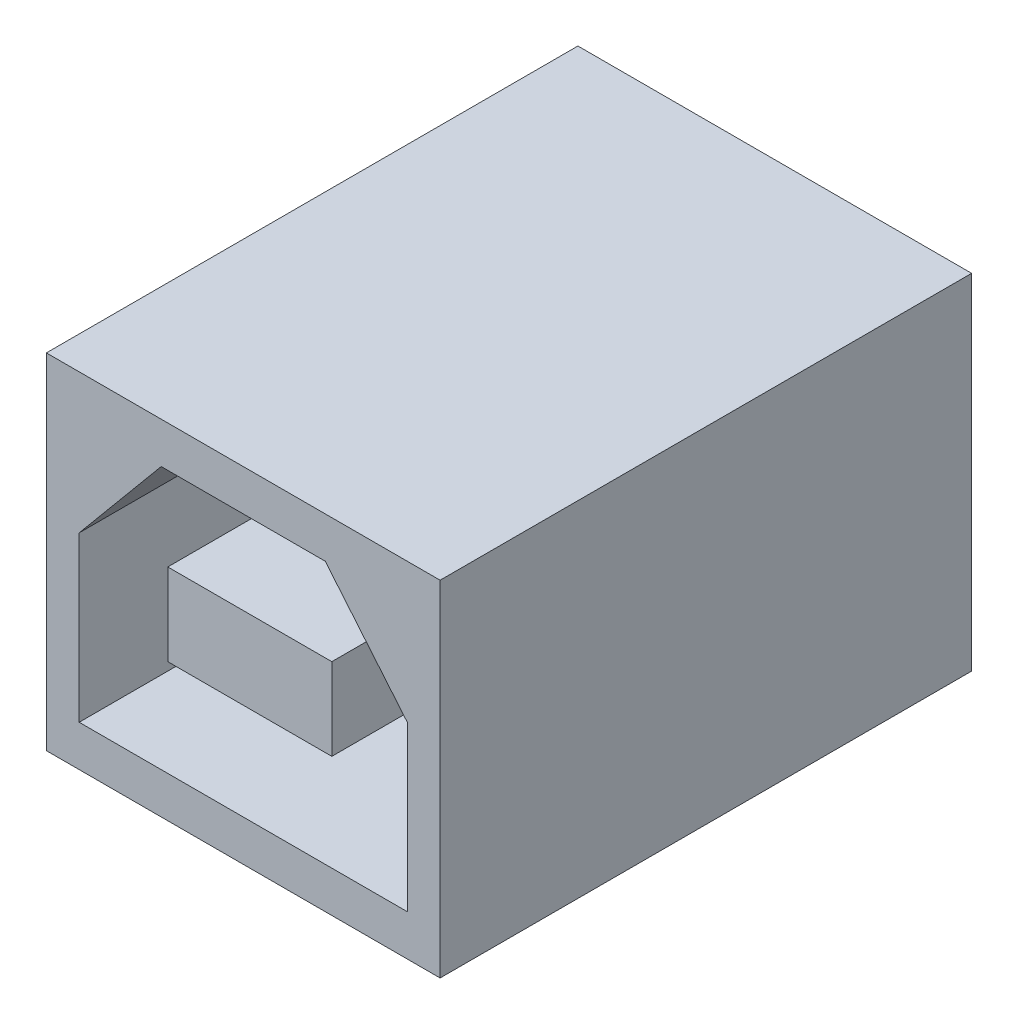
ISO-10303-21;
HEADER;
FILE_DESCRIPTION(('STEP AP214'),'2;1');
FILE_NAME('part.step','',(''),(''),'','','');
FILE_SCHEMA(('AUTOMOTIVE_DESIGN { 1 0 10303 214 1 1 1 1 }'));
ENDSEC;
DATA;
#1=APPLICATION_CONTEXT('core data for automotive mechanical design processes');
#2=APPLICATION_PROTOCOL_DEFINITION('international standard','automotive_design',2000,#1);
#3=PRODUCT_CONTEXT('',#1,'mechanical');
#4=PRODUCT('Part','Part','',(#3));
#5=PRODUCT_RELATED_PRODUCT_CATEGORY('part','',(#4));
#6=PRODUCT_DEFINITION_FORMATION('','',#4);
#7=PRODUCT_DEFINITION_CONTEXT('part definition',#1,'design');
#8=PRODUCT_DEFINITION('design','',#6,#7);
#9=PRODUCT_DEFINITION_SHAPE('','',#8);
#10=(LENGTH_UNIT() NAMED_UNIT(*) SI_UNIT(.MILLI.,.METRE.));
#11=(NAMED_UNIT(*) PLANE_ANGLE_UNIT() SI_UNIT($,.RADIAN.));
#12=(NAMED_UNIT(*) SI_UNIT($,.STERADIAN.) SOLID_ANGLE_UNIT());
#13=UNCERTAINTY_MEASURE_WITH_UNIT(LENGTH_MEASURE(1.E-05),#10,'distance_accuracy_value','');
#14=(GEOMETRIC_REPRESENTATION_CONTEXT(3) GLOBAL_UNCERTAINTY_ASSIGNED_CONTEXT((#13)) GLOBAL_UNIT_ASSIGNED_CONTEXT((#10,
#11,#12)) REPRESENTATION_CONTEXT('',''));
#15=CARTESIAN_POINT('',(0.,0.,0.));
#16=DIRECTION('',(0.,0.,1.));
#17=DIRECTION('',(1.,0.,0.));
#18=AXIS2_PLACEMENT_3D('',#15,#16,#17);
#19=CARTESIAN_POINT('',(6.,-5.25,-16.2));
#20=DIRECTION('',(1.,0.,0.));
#21=DIRECTION('',(0.,0.,-1.));
#22=AXIS2_PLACEMENT_3D('',#19,#20,#21);
#23=PLANE('',#22);
#24=DIRECTION('',(0.,1.,0.));
#25=VECTOR('',#24,1.);
#26=CARTESIAN_POINT('',(6.,-5.25,0.));
#27=LINE('',#26,#25);
#28=CARTESIAN_POINT('',(6.,-5.25,0.));
#29=VERTEX_POINT('',#28);
#30=CARTESIAN_POINT('',(6.,5.25,0.));
#31=VERTEX_POINT('',#30);
#32=EDGE_CURVE('E201',#29,#31,#27,.T.);
#33=ORIENTED_EDGE('',*,*,#32,.F.);
#34=DIRECTION('',(0.,0.,1.));
#35=VECTOR('',#34,1.);
#36=CARTESIAN_POINT('',(6.,-5.25,-16.2));
#37=LINE('',#36,#35);
#38=CARTESIAN_POINT('',(6.,-5.25,-16.2));
#39=VERTEX_POINT('',#38);
#40=EDGE_CURVE('E235',#39,#29,#37,.T.);
#41=ORIENTED_EDGE('',*,*,#40,.F.);
#42=DIRECTION('',(0.,1.,0.));
#43=VECTOR('',#42,1.);
#44=CARTESIAN_POINT('',(6.,-5.25,-16.2));
#45=LINE('',#44,#43);
#46=CARTESIAN_POINT('',(6.,5.25,-16.2));
#47=VERTEX_POINT('',#46);
#48=EDGE_CURVE('E211',#39,#47,#45,.T.);
#49=ORIENTED_EDGE('',*,*,#48,.T.);
#50=DIRECTION('',(0.,0.,1.));
#51=VECTOR('',#50,1.);
#52=CARTESIAN_POINT('',(6.,5.25,-16.2));
#53=LINE('',#52,#51);
#54=EDGE_CURVE('E224',#47,#31,#53,.T.);
#55=ORIENTED_EDGE('',*,*,#54,.T.);
#56=EDGE_LOOP('',(#33,#41,#49,#55));
#57=FACE_BOUND('',#56,.T.);
#58=ADVANCED_FACE('F34',(#57),#23,.T.);
#59=CARTESIAN_POINT('',(-6.,-5.25,-16.2));
#60=DIRECTION('',(0.,-1.,0.));
#61=DIRECTION('',(0.,0.,-1.));
#62=AXIS2_PLACEMENT_3D('',#59,#60,#61);
#63=PLANE('',#62);
#64=DIRECTION('',(1.,0.,0.));
#65=VECTOR('',#64,1.);
#66=CARTESIAN_POINT('',(-6.,-5.25,0.));
#67=LINE('',#66,#65);
#68=CARTESIAN_POINT('',(-6.,-5.25,0.));
#69=VERTEX_POINT('',#68);
#70=EDGE_CURVE('E215',#69,#29,#67,.T.);
#71=ORIENTED_EDGE('',*,*,#70,.F.);
#72=DIRECTION('',(0.,0.,1.));
#73=VECTOR('',#72,1.);
#74=CARTESIAN_POINT('',(-6.,-5.25,-16.2));
#75=LINE('',#74,#73);
#76=CARTESIAN_POINT('',(-6.,-5.25,-16.2));
#77=VERTEX_POINT('',#76);
#78=EDGE_CURVE('E237',#77,#69,#75,.T.);
#79=ORIENTED_EDGE('',*,*,#78,.F.);
#80=DIRECTION('',(1.,0.,0.));
#81=VECTOR('',#80,1.);
#82=CARTESIAN_POINT('',(-6.,-5.25,-16.2));
#83=LINE('',#82,#81);
#84=EDGE_CURVE('E221',#77,#39,#83,.T.);
#85=ORIENTED_EDGE('',*,*,#84,.T.);
#86=ORIENTED_EDGE('',*,*,#40,.T.);
#87=EDGE_LOOP('',(#71,#79,#85,#86));
#88=FACE_BOUND('',#87,.T.);
#89=ADVANCED_FACE('F262',(#88),#63,.T.);
#90=CARTESIAN_POINT('',(-6.,-5.25,-16.2));
#91=DIRECTION('',(-1.,0.,0.));
#92=DIRECTION('',(0.,0.,1.));
#93=AXIS2_PLACEMENT_3D('',#90,#91,#92);
#94=PLANE('',#93);
#95=DIRECTION('',(0.,-1.,0.));
#96=VECTOR('',#95,1.);
#97=CARTESIAN_POINT('',(-6.,-5.25,0.));
#98=LINE('',#97,#96);
#99=CARTESIAN_POINT('',(-6.,5.25,0.));
#100=VERTEX_POINT('',#99);
#101=EDGE_CURVE('E230',#100,#69,#98,.T.);
#102=ORIENTED_EDGE('',*,*,#101,.F.);
#103=DIRECTION('',(0.,0.,1.));
#104=VECTOR('',#103,1.);
#105=CARTESIAN_POINT('',(-6.,5.25,-16.2));
#106=LINE('',#105,#104);
#107=CARTESIAN_POINT('',(-6.,5.25,-16.2));
#108=VERTEX_POINT('',#107);
#109=EDGE_CURVE('E239',#108,#100,#106,.T.);
#110=ORIENTED_EDGE('',*,*,#109,.F.);
#111=DIRECTION('',(0.,-1.,0.));
#112=VECTOR('',#111,1.);
#113=CARTESIAN_POINT('',(-6.,-5.25,-16.2));
#114=LINE('',#113,#112);
#115=EDGE_CURVE('E218',#108,#77,#114,.T.);
#116=ORIENTED_EDGE('',*,*,#115,.T.);
#117=ORIENTED_EDGE('',*,*,#78,.T.);
#118=EDGE_LOOP('',(#102,#110,#116,#117));
#119=FACE_BOUND('',#118,.T.);
#120=ADVANCED_FACE('F267',(#119),#94,.T.);
#121=CARTESIAN_POINT('',(-6.,5.25,-16.2));
#122=DIRECTION('',(0.,1.,0.));
#123=DIRECTION('',(0.,0.,1.));
#124=AXIS2_PLACEMENT_3D('',#121,#122,#123);
#125=PLANE('',#124);
#126=DIRECTION('',(-1.,0.,0.));
#127=VECTOR('',#126,1.);
#128=CARTESIAN_POINT('',(-6.,5.25,0.));
#129=LINE('',#128,#127);
#130=EDGE_CURVE('E227',#31,#100,#129,.T.);
#131=ORIENTED_EDGE('',*,*,#130,.F.);
#132=ORIENTED_EDGE('',*,*,#54,.F.);
#133=DIRECTION('',(-1.,0.,0.));
#134=VECTOR('',#133,1.);
#135=CARTESIAN_POINT('',(-6.,5.25,-16.2));
#136=LINE('',#135,#134);
#137=EDGE_CURVE('E214',#47,#108,#136,.T.);
#138=ORIENTED_EDGE('',*,*,#137,.T.);
#139=ORIENTED_EDGE('',*,*,#109,.T.);
#140=EDGE_LOOP('',(#131,#132,#138,#139));
#141=FACE_BOUND('',#140,.T.);
#142=ADVANCED_FACE('F283',(#141),#125,.T.);
#143=CARTESIAN_POINT('',(0.,0.,-16.2));
#144=DIRECTION('',(0.,0.,-1.));
#145=DIRECTION('',(-1.,0.,0.));
#146=AXIS2_PLACEMENT_3D('',#143,#144,#145);
#147=PLANE('',#146);
#148=ORIENTED_EDGE('',*,*,#48,.F.);
#149=ORIENTED_EDGE('',*,*,#84,.F.);
#150=ORIENTED_EDGE('',*,*,#115,.F.);
#151=ORIENTED_EDGE('',*,*,#137,.F.);
#152=EDGE_LOOP('',(#148,#149,#150,#151));
#153=FACE_BOUND('',#152,.T.);
#154=ADVANCED_FACE('F280',(#153),#147,.T.);
#155=CARTESIAN_POINT('',(0.,0.,0.));
#156=DIRECTION('',(0.,0.,-1.));
#157=DIRECTION('',(-1.,0.,0.));
#158=AXIS2_PLACEMENT_3D('',#155,#156,#157);
#159=PLANE('',#158);
#160=DIRECTION('',(1.,0.,0.));
#161=VECTOR('',#160,1.);
#162=CARTESIAN_POINT('',(-5.,-4.,0.));
#163=LINE('',#162,#161);
#164=CARTESIAN_POINT('',(-5.,-4.,0.));
#165=VERTEX_POINT('',#164);
#166=CARTESIAN_POINT('',(5.,-4.,0.));
#167=VERTEX_POINT('',#166);
#168=EDGE_CURVE('E185',#165,#167,#163,.T.);
#169=ORIENTED_EDGE('',*,*,#168,.F.);
#170=DIRECTION('',(0.,-1.,0.));
#171=VECTOR('',#170,1.);
#172=CARTESIAN_POINT('',(-5.,-4.,0.));
#173=LINE('',#172,#171);
#174=CARTESIAN_POINT('',(-5.,1.,0.));
#175=VERTEX_POINT('',#174);
#176=EDGE_CURVE('E56',#175,#165,#173,.T.);
#177=ORIENTED_EDGE('',*,*,#176,.F.);
#178=DIRECTION('',(-0.64018439966448,-0.768221279597376,0.));
#179=VECTOR('',#178,1.);
#180=CARTESIAN_POINT('',(-5.,1.,0.));
#181=LINE('',#180,#179);
#182=CARTESIAN_POINT('',(-2.5,4.,0.));
#183=VERTEX_POINT('',#182);
#184=EDGE_CURVE('E168',#183,#175,#181,.T.);
#185=ORIENTED_EDGE('',*,*,#184,.F.);
#186=DIRECTION('',(-1.,0.,0.));
#187=VECTOR('',#186,1.);
#188=CARTESIAN_POINT('',(-2.5,4.,0.));
#189=LINE('',#188,#187);
#190=CARTESIAN_POINT('',(2.5,4.,0.));
#191=VERTEX_POINT('',#190);
#192=EDGE_CURVE('E194',#191,#183,#189,.T.);
#193=ORIENTED_EDGE('',*,*,#192,.F.);
#194=DIRECTION('',(-0.64018439966448,0.768221279597376,0.));
#195=VECTOR('',#194,1.);
#196=CARTESIAN_POINT('',(5.,1.,0.));
#197=LINE('',#196,#195);
#198=CARTESIAN_POINT('',(5.,1.,0.));
#199=VERTEX_POINT('',#198);
#200=EDGE_CURVE('E191',#199,#191,#197,.T.);
#201=ORIENTED_EDGE('',*,*,#200,.F.);
#202=DIRECTION('',(0.,1.,0.));
#203=VECTOR('',#202,1.);
#204=CARTESIAN_POINT('',(5.,-4.,0.));
#205=LINE('',#204,#203);
#206=EDGE_CURVE('E188',#167,#199,#205,.T.);
#207=ORIENTED_EDGE('',*,*,#206,.F.);
#208=EDGE_LOOP('',(#169,#177,#185,#193,#201,#207));
#209=FACE_BOUND('',#208,.T.);
#210=ORIENTED_EDGE('',*,*,#32,.T.);
#211=ORIENTED_EDGE('',*,*,#130,.T.);
#212=ORIENTED_EDGE('',*,*,#101,.T.);
#213=ORIENTED_EDGE('',*,*,#70,.T.);
#214=EDGE_LOOP('',(#210,#211,#212,#213));
#215=FACE_BOUND('',#214,.T.);
#216=ADVANCED_FACE('F275',(#209,#215),#159,.F.);
#217=CARTESIAN_POINT('',(-5.,-4.,-14.));
#218=DIRECTION('',(-1.,0.,0.));
#219=DIRECTION('',(0.,0.,1.));
#220=AXIS2_PLACEMENT_3D('',#217,#218,#219);
#221=PLANE('',#220);
#222=ORIENTED_EDGE('',*,*,#176,.T.);
#223=DIRECTION('',(0.,0.,1.));
#224=VECTOR('',#223,1.);
#225=CARTESIAN_POINT('',(-5.,-4.,-14.));
#226=LINE('',#225,#224);
#227=CARTESIAN_POINT('',(-5.,-4.,-14.));
#228=VERTEX_POINT('',#227);
#229=EDGE_CURVE('E183',#228,#165,#226,.T.);
#230=ORIENTED_EDGE('',*,*,#229,.F.);
#231=DIRECTION('',(0.,-1.,0.));
#232=VECTOR('',#231,1.);
#233=CARTESIAN_POINT('',(-5.,-4.,-14.));
#234=LINE('',#233,#232);
#235=CARTESIAN_POINT('',(-5.,1.,-14.));
#236=VERTEX_POINT('',#235);
#237=EDGE_CURVE('E164',#236,#228,#234,.T.);
#238=ORIENTED_EDGE('',*,*,#237,.F.);
#239=DIRECTION('',(0.,0.,1.));
#240=VECTOR('',#239,1.);
#241=CARTESIAN_POINT('',(-5.,1.,-14.));
#242=LINE('',#241,#240);
#243=EDGE_CURVE('E199',#236,#175,#242,.T.);
#244=ORIENTED_EDGE('',*,*,#243,.T.);
#245=EDGE_LOOP('',(#222,#230,#238,#244));
#246=FACE_BOUND('',#245,.T.);
#247=ADVANCED_FACE('F293',(#246),#221,.F.);
#248=CARTESIAN_POINT('',(-5.,1.,-14.));
#249=DIRECTION('',(-0.768221279597376,0.64018439966448,0.));
#250=DIRECTION('',(-0.64018439966448,-0.768221279597376,0.));
#251=AXIS2_PLACEMENT_3D('',#248,#249,#250);
#252=PLANE('',#251);
#253=ORIENTED_EDGE('',*,*,#184,.T.);
#254=ORIENTED_EDGE('',*,*,#243,.F.);
#255=DIRECTION('',(-0.64018439966448,-0.768221279597376,0.));
#256=VECTOR('',#255,1.);
#257=CARTESIAN_POINT('',(-5.,1.,-14.));
#258=LINE('',#257,#256);
#259=CARTESIAN_POINT('',(-2.5,4.,-14.));
#260=VERTEX_POINT('',#259);
#261=EDGE_CURVE('E180',#260,#236,#258,.T.);
#262=ORIENTED_EDGE('',*,*,#261,.F.);
#263=DIRECTION('',(0.,0.,1.));
#264=VECTOR('',#263,1.);
#265=CARTESIAN_POINT('',(-2.5,4.,-14.));
#266=LINE('',#265,#264);
#267=EDGE_CURVE('E202',#260,#183,#266,.T.);
#268=ORIENTED_EDGE('',*,*,#267,.T.);
#269=EDGE_LOOP('',(#253,#254,#262,#268));
#270=FACE_BOUND('',#269,.T.);
#271=ADVANCED_FACE('F299',(#270),#252,.F.);
#272=CARTESIAN_POINT('',(-2.5,4.,-14.));
#273=DIRECTION('',(0.,1.,0.));
#274=DIRECTION('',(0.,0.,1.));
#275=AXIS2_PLACEMENT_3D('',#272,#273,#274);
#276=PLANE('',#275);
#277=ORIENTED_EDGE('',*,*,#192,.T.);
#278=ORIENTED_EDGE('',*,*,#267,.F.);
#279=DIRECTION('',(-1.,0.,0.));
#280=VECTOR('',#279,1.);
#281=CARTESIAN_POINT('',(-2.5,4.,-14.));
#282=LINE('',#281,#280);
#283=CARTESIAN_POINT('',(2.5,4.,-14.));
#284=VERTEX_POINT('',#283);
#285=EDGE_CURVE('E177',#284,#260,#282,.T.);
#286=ORIENTED_EDGE('',*,*,#285,.F.);
#287=DIRECTION('',(0.,0.,1.));
#288=VECTOR('',#287,1.);
#289=CARTESIAN_POINT('',(2.5,4.,-14.));
#290=LINE('',#289,#288);
#291=EDGE_CURVE('E204',#284,#191,#290,.T.);
#292=ORIENTED_EDGE('',*,*,#291,.T.);
#293=EDGE_LOOP('',(#277,#278,#286,#292));
#294=FACE_BOUND('',#293,.T.);
#295=ADVANCED_FACE('F311',(#294),#276,.F.);
#296=CARTESIAN_POINT('',(5.,1.,-14.));
#297=DIRECTION('',(0.768221279597376,0.64018439966448,0.));
#298=DIRECTION('',(-0.64018439966448,0.768221279597376,0.));
#299=AXIS2_PLACEMENT_3D('',#296,#297,#298);
#300=PLANE('',#299);
#301=ORIENTED_EDGE('',*,*,#200,.T.);
#302=ORIENTED_EDGE('',*,*,#291,.F.);
#303=DIRECTION('',(-0.64018439966448,0.768221279597376,0.));
#304=VECTOR('',#303,1.);
#305=CARTESIAN_POINT('',(5.,1.,-14.));
#306=LINE('',#305,#304);
#307=CARTESIAN_POINT('',(5.,1.,-14.));
#308=VERTEX_POINT('',#307);
#309=EDGE_CURVE('E174',#308,#284,#306,.T.);
#310=ORIENTED_EDGE('',*,*,#309,.F.);
#311=DIRECTION('',(0.,0.,1.));
#312=VECTOR('',#311,1.);
#313=CARTESIAN_POINT('',(5.,1.,-14.));
#314=LINE('',#313,#312);
#315=EDGE_CURVE('E206',#308,#199,#314,.T.);
#316=ORIENTED_EDGE('',*,*,#315,.T.);
#317=EDGE_LOOP('',(#301,#302,#310,#316));
#318=FACE_BOUND('',#317,.T.);
#319=ADVANCED_FACE('F307',(#318),#300,.F.);
#320=CARTESIAN_POINT('',(5.,-4.,-14.));
#321=DIRECTION('',(1.,0.,0.));
#322=DIRECTION('',(0.,1.,0.));
#323=AXIS2_PLACEMENT_3D('',#320,#321,#322);
#324=PLANE('',#323);
#325=ORIENTED_EDGE('',*,*,#206,.T.);
#326=ORIENTED_EDGE('',*,*,#315,.F.);
#327=DIRECTION('',(0.,1.,0.));
#328=VECTOR('',#327,1.);
#329=CARTESIAN_POINT('',(5.,-4.,-14.));
#330=LINE('',#329,#328);
#331=CARTESIAN_POINT('',(5.,-4.,-14.));
#332=VERTEX_POINT('',#331);
#333=EDGE_CURVE('E171',#332,#308,#330,.T.);
#334=ORIENTED_EDGE('',*,*,#333,.F.);
#335=DIRECTION('',(0.,0.,1.));
#336=VECTOR('',#335,1.);
#337=CARTESIAN_POINT('',(5.,-4.,-14.));
#338=LINE('',#337,#336);
#339=EDGE_CURVE('E208',#332,#167,#338,.T.);
#340=ORIENTED_EDGE('',*,*,#339,.T.);
#341=EDGE_LOOP('',(#325,#326,#334,#340));
#342=FACE_BOUND('',#341,.T.);
#343=ADVANCED_FACE('F303',(#342),#324,.F.);
#344=CARTESIAN_POINT('',(-5.,-4.,-14.));
#345=DIRECTION('',(0.,-1.,0.));
#346=DIRECTION('',(0.,0.,-1.));
#347=AXIS2_PLACEMENT_3D('',#344,#345,#346);
#348=PLANE('',#347);
#349=ORIENTED_EDGE('',*,*,#168,.T.);
#350=ORIENTED_EDGE('',*,*,#339,.F.);
#351=DIRECTION('',(1.,0.,0.));
#352=VECTOR('',#351,1.);
#353=CARTESIAN_POINT('',(-5.,-4.,-14.));
#354=LINE('',#353,#352);
#355=EDGE_CURVE('E167',#228,#332,#354,.T.);
#356=ORIENTED_EDGE('',*,*,#355,.F.);
#357=ORIENTED_EDGE('',*,*,#229,.T.);
#358=EDGE_LOOP('',(#349,#350,#356,#357));
#359=FACE_BOUND('',#358,.T.);
#360=ADVANCED_FACE('F300',(#359),#348,.F.);
#361=CARTESIAN_POINT('',(0.,0.,-14.));
#362=DIRECTION('',(0.,0.,-1.));
#363=DIRECTION('',(-1.,0.,0.));
#364=AXIS2_PLACEMENT_3D('',#361,#362,#363);
#365=PLANE('',#364);
#366=DIRECTION('',(-1.,0.,0.));
#367=VECTOR('',#366,1.);
#368=CARTESIAN_POINT('',(0.,-1.25,-14.));
#369=LINE('',#368,#367);
#370=CARTESIAN_POINT('',(2.5,-1.25,-14.));
#371=VERTEX_POINT('',#370);
#372=CARTESIAN_POINT('',(-2.5,-1.25,-14.));
#373=VERTEX_POINT('',#372);
#374=EDGE_CURVE('E41',#371,#373,#369,.T.);
#375=ORIENTED_EDGE('',*,*,#374,.T.);
#376=DIRECTION('',(0.,1.,0.));
#377=VECTOR('',#376,1.);
#378=CARTESIAN_POINT('',(-2.5,0.,-14.));
#379=LINE('',#378,#377);
#380=CARTESIAN_POINT('',(-2.5,1.25,-14.));
#381=VERTEX_POINT('',#380);
#382=EDGE_CURVE('E11',#373,#381,#379,.T.);
#383=ORIENTED_EDGE('',*,*,#382,.T.);
#384=DIRECTION('',(1.,0.,0.));
#385=VECTOR('',#384,1.);
#386=CARTESIAN_POINT('',(0.,1.25,-14.));
#387=LINE('',#386,#385);
#388=CARTESIAN_POINT('',(2.5,1.25,-14.));
#389=VERTEX_POINT('',#388);
#390=EDGE_CURVE('E137',#381,#389,#387,.T.);
#391=ORIENTED_EDGE('',*,*,#390,.T.);
#392=DIRECTION('',(0.,-1.,0.));
#393=VECTOR('',#392,1.);
#394=CARTESIAN_POINT('',(2.5,0.,-14.));
#395=LINE('',#394,#393);
#396=EDGE_CURVE('E243',#389,#371,#395,.T.);
#397=ORIENTED_EDGE('',*,*,#396,.T.);
#398=EDGE_LOOP('',(#375,#383,#391,#397));
#399=FACE_BOUND('',#398,.T.);
#400=ORIENTED_EDGE('',*,*,#237,.T.);
#401=ORIENTED_EDGE('',*,*,#355,.T.);
#402=ORIENTED_EDGE('',*,*,#333,.T.);
#403=ORIENTED_EDGE('',*,*,#309,.T.);
#404=ORIENTED_EDGE('',*,*,#285,.T.);
#405=ORIENTED_EDGE('',*,*,#261,.T.);
#406=EDGE_LOOP('',(#400,#401,#402,#403,#404,#405));
#407=FACE_BOUND('',#406,.T.);
#408=ADVANCED_FACE('F247',(#399,#407),#365,.F.);
#409=CARTESIAN_POINT('',(-2.5,-1.25,-0.199999999999999));
#410=DIRECTION('',(-1.,0.,0.));
#411=DIRECTION('',(0.,0.,1.));
#412=AXIS2_PLACEMENT_3D('',#409,#410,#411);
#413=PLANE('',#412);
#414=ORIENTED_EDGE('',*,*,#382,.F.);
#415=DIRECTION('',(0.,0.,-1.));
#416=VECTOR('',#415,1.);
#417=CARTESIAN_POINT('',(-2.5,-1.25,-0.199999999999999));
#418=LINE('',#417,#416);
#419=CARTESIAN_POINT('',(-2.5,-1.25,-0.199999999999999));
#420=VERTEX_POINT('',#419);
#421=EDGE_CURVE('E154',#420,#373,#418,.T.);
#422=ORIENTED_EDGE('',*,*,#421,.F.);
#423=DIRECTION('',(0.,1.,0.));
#424=VECTOR('',#423,1.);
#425=CARTESIAN_POINT('',(-2.5,-1.25,-0.199999999999999));
#426=LINE('',#425,#424);
#427=CARTESIAN_POINT('',(-2.5,1.25,-0.199999999999999));
#428=VERTEX_POINT('',#427);
#429=EDGE_CURVE('E147',#420,#428,#426,.T.);
#430=ORIENTED_EDGE('',*,*,#429,.T.);
#431=DIRECTION('',(0.,0.,-1.));
#432=VECTOR('',#431,1.);
#433=CARTESIAN_POINT('',(-2.5,1.25,-0.199999999999999));
#434=LINE('',#433,#432);
#435=EDGE_CURVE('E132',#428,#381,#434,.T.);
#436=ORIENTED_EDGE('',*,*,#435,.T.);
#437=EDGE_LOOP('',(#414,#422,#430,#436));
#438=FACE_BOUND('',#437,.T.);
#439=ADVANCED_FACE('F152',(#438),#413,.T.);
#440=CARTESIAN_POINT('',(2.5,-1.25,-0.199999999999999));
#441=DIRECTION('',(0.,-1.,0.));
#442=DIRECTION('',(0.,0.,-1.));
#443=AXIS2_PLACEMENT_3D('',#440,#441,#442);
#444=PLANE('',#443);
#445=ORIENTED_EDGE('',*,*,#374,.F.);
#446=DIRECTION('',(0.,0.,-1.));
#447=VECTOR('',#446,1.);
#448=CARTESIAN_POINT('',(2.5,-1.25,-0.199999999999999));
#449=LINE('',#448,#447);
#450=CARTESIAN_POINT('',(2.5,-1.25,-0.199999999999999));
#451=VERTEX_POINT('',#450);
#452=EDGE_CURVE('E160',#451,#371,#449,.T.);
#453=ORIENTED_EDGE('',*,*,#452,.F.);
#454=DIRECTION('',(-1.,0.,0.));
#455=VECTOR('',#454,1.);
#456=CARTESIAN_POINT('',(2.5,-1.25,-0.199999999999999));
#457=LINE('',#456,#455);
#458=EDGE_CURVE('E140',#451,#420,#457,.T.);
#459=ORIENTED_EDGE('',*,*,#458,.T.);
#460=ORIENTED_EDGE('',*,*,#421,.T.);
#461=EDGE_LOOP('',(#445,#453,#459,#460));
#462=FACE_BOUND('',#461,.T.);
#463=ADVANCED_FACE('F250',(#462),#444,.T.);
#464=CARTESIAN_POINT('',(2.5,-1.25,-0.199999999999999));
#465=DIRECTION('',(1.,0.,0.));
#466=DIRECTION('',(0.,0.,-1.));
#467=AXIS2_PLACEMENT_3D('',#464,#465,#466);
#468=PLANE('',#467);
#469=ORIENTED_EDGE('',*,*,#396,.F.);
#470=DIRECTION('',(0.,0.,-1.));
#471=VECTOR('',#470,1.);
#472=CARTESIAN_POINT('',(2.5,1.25,-0.199999999999999));
#473=LINE('',#472,#471);
#474=CARTESIAN_POINT('',(2.5,1.25,-0.199999999999999));
#475=VERTEX_POINT('',#474);
#476=EDGE_CURVE('E48',#475,#389,#473,.T.);
#477=ORIENTED_EDGE('',*,*,#476,.F.);
#478=DIRECTION('',(0.,-1.,0.));
#479=VECTOR('',#478,1.);
#480=CARTESIAN_POINT('',(2.5,-1.25,-0.199999999999999));
#481=LINE('',#480,#479);
#482=EDGE_CURVE('E150',#475,#451,#481,.T.);
#483=ORIENTED_EDGE('',*,*,#482,.T.);
#484=ORIENTED_EDGE('',*,*,#452,.T.);
#485=EDGE_LOOP('',(#469,#477,#483,#484));
#486=FACE_BOUND('',#485,.T.);
#487=ADVANCED_FACE('F252',(#486),#468,.T.);
#488=CARTESIAN_POINT('',(2.5,1.25,-0.199999999999999));
#489=DIRECTION('',(0.,1.,0.));
#490=DIRECTION('',(0.,0.,1.));
#491=AXIS2_PLACEMENT_3D('',#488,#489,#490);
#492=PLANE('',#491);
#493=ORIENTED_EDGE('',*,*,#390,.F.);
#494=ORIENTED_EDGE('',*,*,#435,.F.);
#495=DIRECTION('',(1.,0.,0.));
#496=VECTOR('',#495,1.);
#497=CARTESIAN_POINT('',(2.5,1.25,-0.199999999999999));
#498=LINE('',#497,#496);
#499=EDGE_CURVE('E135',#428,#475,#498,.T.);
#500=ORIENTED_EDGE('',*,*,#499,.T.);
#501=ORIENTED_EDGE('',*,*,#476,.T.);
#502=EDGE_LOOP('',(#493,#494,#500,#501));
#503=FACE_BOUND('',#502,.T.);
#504=ADVANCED_FACE('F134',(#503),#492,.T.);
#505=CARTESIAN_POINT('',(0.,0.,-0.199999999999999));
#506=DIRECTION('',(0.,0.,1.));
#507=DIRECTION('',(1.,0.,0.));
#508=AXIS2_PLACEMENT_3D('',#505,#506,#507);
#509=PLANE('',#508);
#510=ORIENTED_EDGE('',*,*,#429,.F.);
#511=ORIENTED_EDGE('',*,*,#458,.F.);
#512=ORIENTED_EDGE('',*,*,#482,.F.);
#513=ORIENTED_EDGE('',*,*,#499,.F.);
#514=EDGE_LOOP('',(#510,#511,#512,#513));
#515=FACE_BOUND('',#514,.T.);
#516=ADVANCED_FACE('F145',(#515),#509,.T.);
#517=CLOSED_SHELL('',(#58,#89,#120,#142,#154,#216,#247,#271,#295,#319,#343,#360,#408,#439,#463,
#487,#504,#516));
#518=MANIFOLD_SOLID_BREP('B2',#517);
#519=ADVANCED_BREP_SHAPE_REPRESENTATION('',(#18,#518),#14);
#520=SHAPE_DEFINITION_REPRESENTATION(#9,#519);
ENDSEC;
END-ISO-10303-21;
